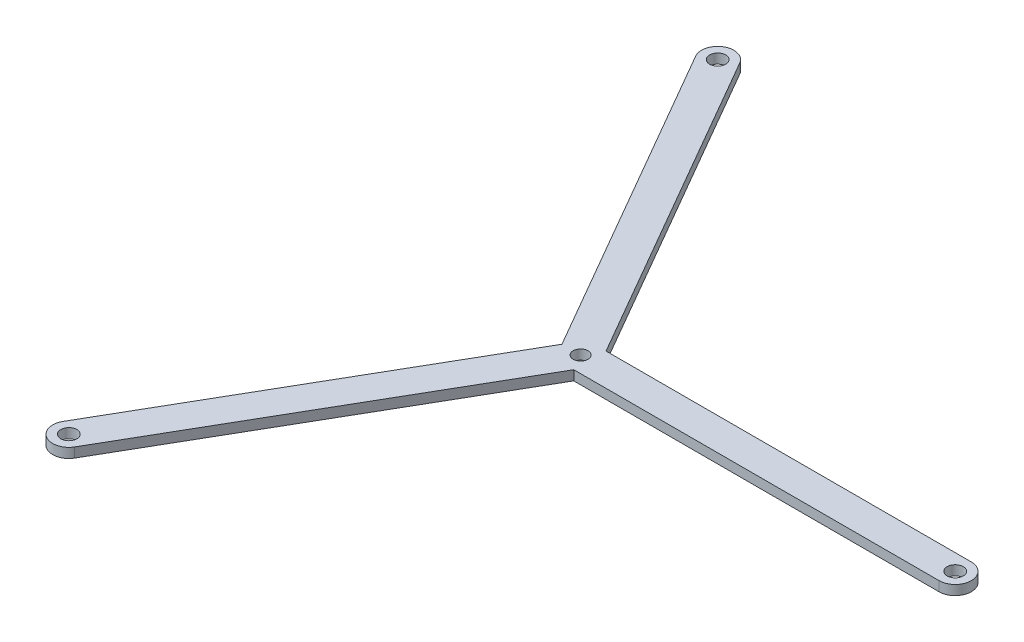
ISO-10303-21;
HEADER;
FILE_DESCRIPTION(('STEP AP214'),'2;1');
FILE_NAME('part.step','',(''),(''),'','','');
FILE_SCHEMA(('AUTOMOTIVE_DESIGN { 1 0 10303 214 1 1 1 1 }'));
ENDSEC;
DATA;
#1=APPLICATION_CONTEXT('core data for automotive mechanical design processes');
#2=APPLICATION_PROTOCOL_DEFINITION('international standard','automotive_design',2000,#1);
#3=PRODUCT_CONTEXT('',#1,'mechanical');
#4=PRODUCT('Part','Part','',(#3));
#5=PRODUCT_RELATED_PRODUCT_CATEGORY('part','',(#4));
#6=PRODUCT_DEFINITION_FORMATION('','',#4);
#7=PRODUCT_DEFINITION_CONTEXT('part definition',#1,'design');
#8=PRODUCT_DEFINITION('design','',#6,#7);
#9=PRODUCT_DEFINITION_SHAPE('','',#8);
#10=(LENGTH_UNIT() NAMED_UNIT(*) SI_UNIT(.MILLI.,.METRE.));
#11=(NAMED_UNIT(*) PLANE_ANGLE_UNIT() SI_UNIT($,.RADIAN.));
#12=(NAMED_UNIT(*) SI_UNIT($,.STERADIAN.) SOLID_ANGLE_UNIT());
#13=UNCERTAINTY_MEASURE_WITH_UNIT(LENGTH_MEASURE(1.E-05),#10,'distance_accuracy_value','');
#14=(GEOMETRIC_REPRESENTATION_CONTEXT(3) GLOBAL_UNCERTAINTY_ASSIGNED_CONTEXT((#13)) GLOBAL_UNIT_ASSIGNED_CONTEXT((#10,
#11,#12)) REPRESENTATION_CONTEXT('',''));
#15=CARTESIAN_POINT('',(0.,0.,0.));
#16=DIRECTION('',(0.,0.,1.));
#17=DIRECTION('',(1.,0.,0.));
#18=AXIS2_PLACEMENT_3D('',#15,#16,#17);
#19=CARTESIAN_POINT('',(4.33012701892218,3.,2.50000000000002));
#20=DIRECTION('',(0.866025403784436,0.,0.500000000000004));
#21=DIRECTION('',(0.500000000000004,0.,-0.866025403784436));
#22=AXIS2_PLACEMENT_3D('',#19,#20,#21);
#23=PLANE('',#22);
#24=DIRECTION('',(-0.500000000000004,0.,0.866025403784436));
#25=VECTOR('',#24,1.);
#26=CARTESIAN_POINT('',(4.33012701892218,0.,2.50000000000002));
#27=LINE('',#26,#25);
#28=CARTESIAN_POINT('',(2.88675134594811,0.,5.));
#29=VERTEX_POINT('',#28);
#30=CARTESIAN_POINT('',(-53.6698729810783,0.,102.958946838995));
#31=VERTEX_POINT('',#30);
#32=EDGE_CURVE('E168',#29,#31,#27,.T.);
#33=ORIENTED_EDGE('',*,*,#32,.F.);
#34=DIRECTION('',(0.,-1.,0.));
#35=VECTOR('',#34,1.);
#36=CARTESIAN_POINT('',(2.88675134594811,3.,5.));
#37=LINE('',#36,#35);
#38=CARTESIAN_POINT('',(2.88675134594811,3.,5.));
#39=VERTEX_POINT('',#38);
#40=EDGE_CURVE('E11',#39,#29,#37,.T.);
#41=ORIENTED_EDGE('',*,*,#40,.F.);
#42=DIRECTION('',(-0.500000000000004,0.,0.866025403784436));
#43=VECTOR('',#42,1.);
#44=CARTESIAN_POINT('',(4.33012701892218,3.,2.50000000000002));
#45=LINE('',#44,#43);
#46=CARTESIAN_POINT('',(-53.6698729810783,3.,102.958946838995));
#47=VERTEX_POINT('',#46);
#48=EDGE_CURVE('E213',#39,#47,#45,.T.);
#49=ORIENTED_EDGE('',*,*,#48,.T.);
#50=DIRECTION('',(0.,-1.,0.));
#51=VECTOR('',#50,1.);
#52=CARTESIAN_POINT('',(-53.6698729810783,3.,102.958946838995));
#53=LINE('',#52,#51);
#54=EDGE_CURVE('E99',#47,#31,#53,.T.);
#55=ORIENTED_EDGE('',*,*,#54,.T.);
#56=EDGE_LOOP('',(#33,#41,#49,#55));
#57=FACE_BOUND('',#56,.T.);
#58=ADVANCED_FACE('F45',(#57),#23,.T.);
#59=CARTESIAN_POINT('',(0.,3.,5.));
#60=DIRECTION('',(0.,0.,-1.));
#61=DIRECTION('',(-1.,0.,0.));
#62=AXIS2_PLACEMENT_3D('',#59,#60,#61);
#63=PLANE('',#62);
#64=DIRECTION('',(1.,0.,0.));
#65=VECTOR('',#64,1.);
#66=CARTESIAN_POINT('',(0.,0.,5.));
#67=LINE('',#66,#65);
#68=CARTESIAN_POINT('',(116.,0.,5.));
#69=VERTEX_POINT('',#68);
#70=EDGE_CURVE('E172',#29,#69,#67,.T.);
#71=ORIENTED_EDGE('',*,*,#70,.T.);
#72=DIRECTION('',(0.,-1.,0.));
#73=VECTOR('',#72,1.);
#74=CARTESIAN_POINT('',(116.,3.,5.));
#75=LINE('',#74,#73);
#76=CARTESIAN_POINT('',(116.,3.,5.));
#77=VERTEX_POINT('',#76);
#78=EDGE_CURVE('E54',#77,#69,#75,.T.);
#79=ORIENTED_EDGE('',*,*,#78,.F.);
#80=DIRECTION('',(1.,0.,0.));
#81=VECTOR('',#80,1.);
#82=CARTESIAN_POINT('',(0.,3.,5.));
#83=LINE('',#82,#81);
#84=EDGE_CURVE('E256',#39,#77,#83,.T.);
#85=ORIENTED_EDGE('',*,*,#84,.F.);
#86=ORIENTED_EDGE('',*,*,#40,.T.);
#87=EDGE_LOOP('',(#71,#79,#85,#86));
#88=FACE_BOUND('',#87,.T.);
#89=ADVANCED_FACE('F262',(#88),#63,.F.);
#90=CARTESIAN_POINT('',(116.,3.,0.));
#91=DIRECTION('',(0.,-1.,0.));
#92=DIRECTION('',(0.,0.,-1.));
#93=AXIS2_PLACEMENT_3D('',#90,#91,#92);
#94=CYLINDRICAL_SURFACE('',#93,5.);
#95=CARTESIAN_POINT('',(116.,0.,0.));
#96=DIRECTION('',(0.,1.,0.));
#97=DIRECTION('',(0.,0.,1.));
#98=AXIS2_PLACEMENT_3D('',#95,#96,#97);
#99=CIRCLE('',#98,5.);
#100=CARTESIAN_POINT('',(116.,0.,-5.));
#101=VERTEX_POINT('',#100);
#102=EDGE_CURVE('E175',#69,#101,#99,.T.);
#103=ORIENTED_EDGE('',*,*,#102,.T.);
#104=DIRECTION('',(0.,-1.,0.));
#105=VECTOR('',#104,1.);
#106=CARTESIAN_POINT('',(116.,3.,-5.));
#107=LINE('',#106,#105);
#108=CARTESIAN_POINT('',(116.,3.,-5.));
#109=VERTEX_POINT('',#108);
#110=EDGE_CURVE('E227',#109,#101,#107,.T.);
#111=ORIENTED_EDGE('',*,*,#110,.F.);
#112=CARTESIAN_POINT('',(116.,3.,0.));
#113=DIRECTION('',(0.,1.,0.));
#114=DIRECTION('',(0.,0.,1.));
#115=AXIS2_PLACEMENT_3D('',#112,#113,#114);
#116=CIRCLE('',#115,5.);
#117=EDGE_CURVE('E237',#77,#109,#116,.T.);
#118=ORIENTED_EDGE('',*,*,#117,.F.);
#119=ORIENTED_EDGE('',*,*,#78,.T.);
#120=EDGE_LOOP('',(#103,#111,#118,#119));
#121=FACE_BOUND('',#120,.T.);
#122=ADVANCED_FACE('F235',(#121),#94,.T.);
#123=CARTESIAN_POINT('',(0.,3.,-5.));
#124=DIRECTION('',(0.,0.,-1.));
#125=DIRECTION('',(-1.,0.,0.));
#126=AXIS2_PLACEMENT_3D('',#123,#124,#125);
#127=PLANE('',#126);
#128=DIRECTION('',(1.,0.,0.));
#129=VECTOR('',#128,1.);
#130=CARTESIAN_POINT('',(0.,0.,-5.));
#131=LINE('',#130,#129);
#132=CARTESIAN_POINT('',(2.88675134594816,0.,-5.));
#133=VERTEX_POINT('',#132);
#134=EDGE_CURVE('E179',#133,#101,#131,.T.);
#135=ORIENTED_EDGE('',*,*,#134,.F.);
#136=DIRECTION('',(0.,-1.,0.));
#137=VECTOR('',#136,1.);
#138=CARTESIAN_POINT('',(2.88675134594816,3.,-5.));
#139=LINE('',#138,#137);
#140=CARTESIAN_POINT('',(2.88675134594816,3.,-5.));
#141=VERTEX_POINT('',#140);
#142=EDGE_CURVE('E224',#141,#133,#139,.T.);
#143=ORIENTED_EDGE('',*,*,#142,.F.);
#144=DIRECTION('',(1.,0.,0.));
#145=VECTOR('',#144,1.);
#146=CARTESIAN_POINT('',(0.,3.,-5.));
#147=LINE('',#146,#145);
#148=EDGE_CURVE('E251',#141,#109,#147,.T.);
#149=ORIENTED_EDGE('',*,*,#148,.T.);
#150=ORIENTED_EDGE('',*,*,#110,.T.);
#151=EDGE_LOOP('',(#135,#143,#149,#150));
#152=FACE_BOUND('',#151,.T.);
#153=ADVANCED_FACE('F247',(#152),#127,.T.);
#154=CARTESIAN_POINT('',(4.33012701892221,3.,-2.49999999999996));
#155=DIRECTION('',(-0.866025403784443,0.,0.499999999999992));
#156=DIRECTION('',(0.499999999999992,0.,0.866025403784443));
#157=AXIS2_PLACEMENT_3D('',#154,#155,#156);
#158=PLANE('',#157);
#159=DIRECTION('',(-0.499999999999992,0.,-0.866025403784443));
#160=VECTOR('',#159,1.);
#161=CARTESIAN_POINT('',(4.33012701892221,0.,-2.49999999999996));
#162=LINE('',#161,#160);
#163=CARTESIAN_POINT('',(-53.6698729810768,0.,-102.958946838995));
#164=VERTEX_POINT('',#163);
#165=EDGE_CURVE('E183',#133,#164,#162,.T.);
#166=ORIENTED_EDGE('',*,*,#165,.T.);
#167=DIRECTION('',(0.,-1.,0.));
#168=VECTOR('',#167,1.);
#169=CARTESIAN_POINT('',(-53.6698729810768,3.,-102.958946838995));
#170=LINE('',#169,#168);
#171=CARTESIAN_POINT('',(-53.6698729810768,3.,-102.958946838995));
#172=VERTEX_POINT('',#171);
#173=EDGE_CURVE('E220',#172,#164,#170,.T.);
#174=ORIENTED_EDGE('',*,*,#173,.F.);
#175=DIRECTION('',(-0.499999999999992,0.,-0.866025403784443));
#176=VECTOR('',#175,1.);
#177=CARTESIAN_POINT('',(4.33012701892221,3.,-2.49999999999996));
#178=LINE('',#177,#176);
#179=EDGE_CURVE('E146',#141,#172,#178,.T.);
#180=ORIENTED_EDGE('',*,*,#179,.F.);
#181=ORIENTED_EDGE('',*,*,#142,.T.);
#182=EDGE_LOOP('',(#166,#174,#180,#181));
#183=FACE_BOUND('',#182,.T.);
#184=ADVANCED_FACE('F272',(#183),#158,.F.);
#185=CARTESIAN_POINT('',(-57.999999999999,3.,-100.458946838995));
#186=DIRECTION('',(0.,-1.,0.));
#187=DIRECTION('',(0.,0.,-1.));
#188=AXIS2_PLACEMENT_3D('',#185,#186,#187);
#189=CYLINDRICAL_SURFACE('',#188,5.);
#190=CARTESIAN_POINT('',(-57.999999999999,0.,-100.458946838995));
#191=DIRECTION('',(0.,1.,0.));
#192=DIRECTION('',(0.,0.,1.));
#193=AXIS2_PLACEMENT_3D('',#190,#191,#192);
#194=CIRCLE('',#193,5.);
#195=CARTESIAN_POINT('',(-62.3301270189212,0.,-97.9589468389954));
#196=VERTEX_POINT('',#195);
#197=EDGE_CURVE('E186',#164,#196,#194,.T.);
#198=ORIENTED_EDGE('',*,*,#197,.T.);
#199=DIRECTION('',(0.,-1.,0.));
#200=VECTOR('',#199,1.);
#201=CARTESIAN_POINT('',(-62.3301270189212,3.,-97.9589468389954));
#202=LINE('',#201,#200);
#203=CARTESIAN_POINT('',(-62.3301270189212,3.,-97.9589468389954));
#204=VERTEX_POINT('',#203);
#205=EDGE_CURVE('E131',#204,#196,#202,.T.);
#206=ORIENTED_EDGE('',*,*,#205,.F.);
#207=CARTESIAN_POINT('',(-57.999999999999,3.,-100.458946838995));
#208=DIRECTION('',(0.,1.,0.));
#209=DIRECTION('',(0.,0.,1.));
#210=AXIS2_PLACEMENT_3D('',#207,#208,#209);
#211=CIRCLE('',#210,5.);
#212=EDGE_CURVE('E141',#172,#204,#211,.T.);
#213=ORIENTED_EDGE('',*,*,#212,.F.);
#214=ORIENTED_EDGE('',*,*,#173,.T.);
#215=EDGE_LOOP('',(#198,#206,#213,#214));
#216=FACE_BOUND('',#215,.T.);
#217=ADVANCED_FACE('F275',(#216),#189,.T.);
#218=CARTESIAN_POINT('',(-4.33012701892222,3.,2.49999999999996));
#219=DIRECTION('',(-0.866025403784443,0.,0.499999999999992));
#220=DIRECTION('',(0.499999999999992,0.,0.866025403784443));
#221=AXIS2_PLACEMENT_3D('',#218,#219,#220);
#222=PLANE('',#221);
#223=DIRECTION('',(-0.499999999999992,0.,-0.866025403784443));
#224=VECTOR('',#223,1.);
#225=CARTESIAN_POINT('',(-4.33012701892222,0.,2.49999999999996));
#226=LINE('',#225,#224);
#227=CARTESIAN_POINT('',(-5.77350269189625,0.,0.));
#228=VERTEX_POINT('',#227);
#229=EDGE_CURVE('E129',#228,#196,#226,.T.);
#230=ORIENTED_EDGE('',*,*,#229,.F.);
#231=DIRECTION('',(0.,-1.,0.));
#232=VECTOR('',#231,1.);
#233=CARTESIAN_POINT('',(-5.77350269189625,3.,0.));
#234=LINE('',#233,#232);
#235=CARTESIAN_POINT('',(-5.77350269189625,3.,0.));
#236=VERTEX_POINT('',#235);
#237=EDGE_CURVE('E123',#236,#228,#234,.T.);
#238=ORIENTED_EDGE('',*,*,#237,.F.);
#239=DIRECTION('',(-0.499999999999992,0.,-0.866025403784443));
#240=VECTOR('',#239,1.);
#241=CARTESIAN_POINT('',(-4.33012701892222,3.,2.49999999999996));
#242=LINE('',#241,#240);
#243=EDGE_CURVE('E127',#236,#204,#242,.T.);
#244=ORIENTED_EDGE('',*,*,#243,.T.);
#245=ORIENTED_EDGE('',*,*,#205,.T.);
#246=EDGE_LOOP('',(#230,#238,#244,#245));
#247=FACE_BOUND('',#246,.T.);
#248=ADVANCED_FACE('F125',(#247),#222,.T.);
#249=CARTESIAN_POINT('',(-4.33012701892218,3.,-2.50000000000002));
#250=DIRECTION('',(0.866025403784436,0.,0.500000000000004));
#251=DIRECTION('',(0.500000000000004,0.,-0.866025403784436));
#252=AXIS2_PLACEMENT_3D('',#249,#250,#251);
#253=PLANE('',#252);
#254=DIRECTION('',(-0.500000000000004,0.,0.866025403784436));
#255=VECTOR('',#254,1.);
#256=CARTESIAN_POINT('',(-4.33012701892218,0.,-2.50000000000002));
#257=LINE('',#256,#255);
#258=CARTESIAN_POINT('',(-62.3301270189226,0.,97.9589468389946));
#259=VERTEX_POINT('',#258);
#260=EDGE_CURVE('E92',#228,#259,#257,.T.);
#261=ORIENTED_EDGE('',*,*,#260,.T.);
#262=DIRECTION('',(0.,-1.,0.));
#263=VECTOR('',#262,1.);
#264=CARTESIAN_POINT('',(-62.3301270189226,3.,97.9589468389946));
#265=LINE('',#264,#263);
#266=CARTESIAN_POINT('',(-62.3301270189226,3.,97.9589468389946));
#267=VERTEX_POINT('',#266);
#268=EDGE_CURVE('E132',#267,#259,#265,.T.);
#269=ORIENTED_EDGE('',*,*,#268,.F.);
#270=DIRECTION('',(-0.500000000000004,0.,0.866025403784436));
#271=VECTOR('',#270,1.);
#272=CARTESIAN_POINT('',(-4.33012701892218,3.,-2.50000000000002));
#273=LINE('',#272,#271);
#274=EDGE_CURVE('E134',#236,#267,#273,.T.);
#275=ORIENTED_EDGE('',*,*,#274,.F.);
#276=ORIENTED_EDGE('',*,*,#237,.T.);
#277=EDGE_LOOP('',(#261,#269,#275,#276));
#278=FACE_BOUND('',#277,.T.);
#279=ADVANCED_FACE('F135',(#278),#253,.F.);
#280=CARTESIAN_POINT('',(116.,3.,0.));
#281=DIRECTION('',(0.,-1.,0.));
#282=DIRECTION('',(0.,0.,-1.));
#283=AXIS2_PLACEMENT_3D('',#280,#281,#282);
#284=CYLINDRICAL_SURFACE('',#283,2.5);
#285=CARTESIAN_POINT('',(116.,3.,0.));
#286=DIRECTION('',(0.,1.,0.));
#287=DIRECTION('',(0.,0.,1.));
#288=AXIS2_PLACEMENT_3D('',#285,#286,#287);
#289=CIRCLE('',#288,2.5);
#290=CARTESIAN_POINT('',(116.,3.,2.5));
#291=VERTEX_POINT('',#290);
#292=EDGE_CURVE('E160',#291,#291,#289,.T.);
#293=ORIENTED_EDGE('',*,*,#292,.T.);
#294=EDGE_LOOP('',(#293));
#295=FACE_BOUND('',#294,.T.);
#296=CARTESIAN_POINT('',(116.,0.,0.));
#297=DIRECTION('',(0.,1.,0.));
#298=DIRECTION('',(0.,0.,1.));
#299=AXIS2_PLACEMENT_3D('',#296,#297,#298);
#300=CIRCLE('',#299,2.5);
#301=CARTESIAN_POINT('',(116.,0.,2.5));
#302=VERTEX_POINT('',#301);
#303=EDGE_CURVE('E205',#302,#302,#300,.T.);
#304=ORIENTED_EDGE('',*,*,#303,.F.);
#305=EDGE_LOOP('',(#304));
#306=FACE_BOUND('',#305,.T.);
#307=ADVANCED_FACE('F284',(#295,#306),#284,.F.);
#308=CARTESIAN_POINT('',(0.,3.,0.));
#309=DIRECTION('',(0.,-1.,0.));
#310=DIRECTION('',(0.,0.,-1.));
#311=AXIS2_PLACEMENT_3D('',#308,#309,#310);
#312=CYLINDRICAL_SURFACE('',#311,2.3);
#313=CARTESIAN_POINT('',(0.,3.,0.));
#314=DIRECTION('',(0.,1.,0.));
#315=DIRECTION('',(0.,0.,1.));
#316=AXIS2_PLACEMENT_3D('',#313,#314,#315);
#317=CIRCLE('',#316,2.3);
#318=CARTESIAN_POINT('',(0.,3.,2.3));
#319=VERTEX_POINT('',#318);
#320=EDGE_CURVE('E156',#319,#319,#317,.T.);
#321=ORIENTED_EDGE('',*,*,#320,.T.);
#322=EDGE_LOOP('',(#321));
#323=FACE_BOUND('',#322,.T.);
#324=CARTESIAN_POINT('',(0.,0.,0.));
#325=DIRECTION('',(0.,1.,0.));
#326=DIRECTION('',(0.,0.,1.));
#327=AXIS2_PLACEMENT_3D('',#324,#325,#326);
#328=CIRCLE('',#327,2.3);
#329=CARTESIAN_POINT('',(0.,0.,2.3));
#330=VERTEX_POINT('',#329);
#331=EDGE_CURVE('E201',#330,#330,#328,.T.);
#332=ORIENTED_EDGE('',*,*,#331,.F.);
#333=EDGE_LOOP('',(#332));
#334=FACE_BOUND('',#333,.T.);
#335=ADVANCED_FACE('F293',(#323,#334),#312,.F.);
#336=CARTESIAN_POINT('',(-57.999999999999,3.,-100.458946838995));
#337=DIRECTION('',(0.,-1.,0.));
#338=DIRECTION('',(0.,0.,-1.));
#339=AXIS2_PLACEMENT_3D('',#336,#337,#338);
#340=CYLINDRICAL_SURFACE('',#339,2.49999999999999);
#341=CARTESIAN_POINT('',(-57.999999999999,3.,-100.458946838995));
#342=DIRECTION('',(0.,1.,0.));
#343=DIRECTION('',(0.,0.,1.));
#344=AXIS2_PLACEMENT_3D('',#341,#342,#343);
#345=CIRCLE('',#344,2.49999999999999);
#346=CARTESIAN_POINT('',(-57.999999999999,3.,-97.9589468389954));
#347=VERTEX_POINT('',#346);
#348=EDGE_CURVE('E152',#347,#347,#345,.T.);
#349=ORIENTED_EDGE('',*,*,#348,.T.);
#350=EDGE_LOOP('',(#349));
#351=FACE_BOUND('',#350,.T.);
#352=CARTESIAN_POINT('',(-57.999999999999,0.,-100.458946838995));
#353=DIRECTION('',(0.,1.,0.));
#354=DIRECTION('',(0.,0.,1.));
#355=AXIS2_PLACEMENT_3D('',#352,#353,#354);
#356=CIRCLE('',#355,2.49999999999999);
#357=CARTESIAN_POINT('',(-57.999999999999,0.,-97.9589468389954));
#358=VERTEX_POINT('',#357);
#359=EDGE_CURVE('E197',#358,#358,#356,.T.);
#360=ORIENTED_EDGE('',*,*,#359,.F.);
#361=EDGE_LOOP('',(#360));
#362=FACE_BOUND('',#361,.T.);
#363=ADVANCED_FACE('F289',(#351,#362),#340,.F.);
#364=CARTESIAN_POINT('',(-58.0000000000004,3.,100.458946838995));
#365=DIRECTION('',(0.,-1.,0.));
#366=DIRECTION('',(0.,0.,-1.));
#367=AXIS2_PLACEMENT_3D('',#364,#365,#366);
#368=CYLINDRICAL_SURFACE('',#367,5.);
#369=CARTESIAN_POINT('',(-58.0000000000004,0.,100.458946838995));
#370=DIRECTION('',(0.,1.,0.));
#371=DIRECTION('',(0.,0.,1.));
#372=AXIS2_PLACEMENT_3D('',#369,#370,#371);
#373=CIRCLE('',#372,5.);
#374=EDGE_CURVE('E194',#259,#31,#373,.T.);
#375=ORIENTED_EDGE('',*,*,#374,.T.);
#376=ORIENTED_EDGE('',*,*,#54,.F.);
#377=CARTESIAN_POINT('',(-58.0000000000004,3.,100.458946838995));
#378=DIRECTION('',(0.,1.,0.));
#379=DIRECTION('',(0.,0.,1.));
#380=AXIS2_PLACEMENT_3D('',#377,#378,#379);
#381=CIRCLE('',#380,5.);
#382=EDGE_CURVE('E62',#267,#47,#381,.T.);
#383=ORIENTED_EDGE('',*,*,#382,.F.);
#384=ORIENTED_EDGE('',*,*,#268,.T.);
#385=EDGE_LOOP('',(#375,#376,#383,#384));
#386=FACE_BOUND('',#385,.T.);
#387=ADVANCED_FACE('F285',(#386),#368,.T.);
#388=CARTESIAN_POINT('',(-58.0000000000004,3.,100.458946838995));
#389=DIRECTION('',(0.,-1.,0.));
#390=DIRECTION('',(0.,0.,-1.));
#391=AXIS2_PLACEMENT_3D('',#388,#389,#390);
#392=CYLINDRICAL_SURFACE('',#391,2.5);
#393=CARTESIAN_POINT('',(-58.0000000000004,3.,100.458946838995));
#394=DIRECTION('',(0.,1.,0.));
#395=DIRECTION('',(0.,0.,1.));
#396=AXIS2_PLACEMENT_3D('',#393,#394,#395);
#397=CIRCLE('',#396,2.5);
#398=CARTESIAN_POINT('',(-58.0000000000004,3.,102.958946838995));
#399=VERTEX_POINT('',#398);
#400=EDGE_CURVE('E164',#399,#399,#397,.T.);
#401=ORIENTED_EDGE('',*,*,#400,.T.);
#402=EDGE_LOOP('',(#401));
#403=FACE_BOUND('',#402,.T.);
#404=CARTESIAN_POINT('',(-58.0000000000004,0.,100.458946838995));
#405=DIRECTION('',(0.,1.,0.));
#406=DIRECTION('',(0.,0.,1.));
#407=AXIS2_PLACEMENT_3D('',#404,#405,#406);
#408=CIRCLE('',#407,2.5);
#409=CARTESIAN_POINT('',(-58.0000000000004,0.,102.958946838995));
#410=VERTEX_POINT('',#409);
#411=EDGE_CURVE('E209',#410,#410,#408,.T.);
#412=ORIENTED_EDGE('',*,*,#411,.F.);
#413=EDGE_LOOP('',(#412));
#414=FACE_BOUND('',#413,.T.);
#415=ADVANCED_FACE('F288',(#403,#414),#392,.F.);
#416=CARTESIAN_POINT('',(0.,3.,0.));
#417=DIRECTION('',(0.,1.,0.));
#418=DIRECTION('',(0.,0.,1.));
#419=AXIS2_PLACEMENT_3D('',#416,#417,#418);
#420=PLANE('',#419);
#421=ORIENTED_EDGE('',*,*,#48,.F.);
#422=ORIENTED_EDGE('',*,*,#84,.T.);
#423=ORIENTED_EDGE('',*,*,#117,.T.);
#424=ORIENTED_EDGE('',*,*,#148,.F.);
#425=ORIENTED_EDGE('',*,*,#179,.T.);
#426=ORIENTED_EDGE('',*,*,#212,.T.);
#427=ORIENTED_EDGE('',*,*,#243,.F.);
#428=ORIENTED_EDGE('',*,*,#274,.T.);
#429=ORIENTED_EDGE('',*,*,#382,.T.);
#430=EDGE_LOOP('',(#421,#422,#423,#424,#425,#426,#427,#428,#429));
#431=FACE_BOUND('',#430,.T.);
#432=ORIENTED_EDGE('',*,*,#348,.F.);
#433=EDGE_LOOP('',(#432));
#434=FACE_BOUND('',#433,.T.);
#435=ORIENTED_EDGE('',*,*,#320,.F.);
#436=EDGE_LOOP('',(#435));
#437=FACE_BOUND('',#436,.T.);
#438=ORIENTED_EDGE('',*,*,#292,.F.);
#439=EDGE_LOOP('',(#438));
#440=FACE_BOUND('',#439,.T.);
#441=ORIENTED_EDGE('',*,*,#400,.F.);
#442=EDGE_LOOP('',(#441));
#443=FACE_BOUND('',#442,.T.);
#444=ADVANCED_FACE('F138',(#431,#434,#437,#440,#443),#420,.T.);
#445=CARTESIAN_POINT('',(0.,0.,0.));
#446=DIRECTION('',(0.,1.,0.));
#447=DIRECTION('',(0.,0.,1.));
#448=AXIS2_PLACEMENT_3D('',#445,#446,#447);
#449=PLANE('',#448);
#450=ORIENTED_EDGE('',*,*,#32,.T.);
#451=ORIENTED_EDGE('',*,*,#374,.F.);
#452=ORIENTED_EDGE('',*,*,#260,.F.);
#453=ORIENTED_EDGE('',*,*,#229,.T.);
#454=ORIENTED_EDGE('',*,*,#197,.F.);
#455=ORIENTED_EDGE('',*,*,#165,.F.);
#456=ORIENTED_EDGE('',*,*,#134,.T.);
#457=ORIENTED_EDGE('',*,*,#102,.F.);
#458=ORIENTED_EDGE('',*,*,#70,.F.);
#459=EDGE_LOOP('',(#450,#451,#452,#453,#454,#455,#456,#457,#458));
#460=FACE_BOUND('',#459,.T.);
#461=ORIENTED_EDGE('',*,*,#359,.T.);
#462=EDGE_LOOP('',(#461));
#463=FACE_BOUND('',#462,.T.);
#464=ORIENTED_EDGE('',*,*,#331,.T.);
#465=EDGE_LOOP('',(#464));
#466=FACE_BOUND('',#465,.T.);
#467=ORIENTED_EDGE('',*,*,#303,.T.);
#468=EDGE_LOOP('',(#467));
#469=FACE_BOUND('',#468,.T.);
#470=ORIENTED_EDGE('',*,*,#411,.T.);
#471=EDGE_LOOP('',(#470));
#472=FACE_BOUND('',#471,.T.);
#473=ADVANCED_FACE('F241',(#460,#463,#466,#469,#472),#449,.F.);
#474=CLOSED_SHELL('',(#58,#89,#122,#153,#184,#217,#248,#279,#307,#335,#363,#387,#415,#444,#473));
#475=MANIFOLD_SOLID_BREP('B2',#474);
#476=ADVANCED_BREP_SHAPE_REPRESENTATION('',(#18,#475),#14);
#477=SHAPE_DEFINITION_REPRESENTATION(#9,#476);
ENDSEC;
END-ISO-10303-21;
